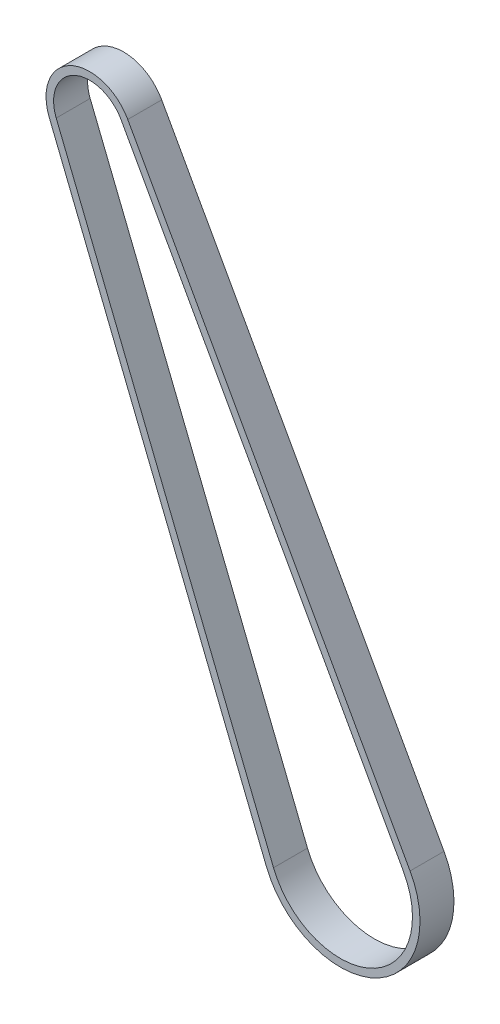
ISO-10303-21;
HEADER;
FILE_DESCRIPTION(('STEP AP214'),'2;1');
FILE_NAME('part.step','',(''),(''),'','','');
FILE_SCHEMA(('AUTOMOTIVE_DESIGN { 1 0 10303 214 1 1 1 1 }'));
ENDSEC;
DATA;
#1=APPLICATION_CONTEXT('core data for automotive mechanical design processes');
#2=APPLICATION_PROTOCOL_DEFINITION('international standard','automotive_design',2000,#1);
#3=PRODUCT_CONTEXT('',#1,'mechanical');
#4=PRODUCT('Part','Part','',(#3));
#5=PRODUCT_RELATED_PRODUCT_CATEGORY('part','',(#4));
#6=PRODUCT_DEFINITION_FORMATION('','',#4);
#7=PRODUCT_DEFINITION_CONTEXT('part definition',#1,'design');
#8=PRODUCT_DEFINITION('design','',#6,#7);
#9=PRODUCT_DEFINITION_SHAPE('','',#8);
#10=(LENGTH_UNIT() NAMED_UNIT(*) SI_UNIT(.MILLI.,.METRE.));
#11=(NAMED_UNIT(*) PLANE_ANGLE_UNIT() SI_UNIT($,.RADIAN.));
#12=(NAMED_UNIT(*) SI_UNIT($,.STERADIAN.) SOLID_ANGLE_UNIT());
#13=UNCERTAINTY_MEASURE_WITH_UNIT(LENGTH_MEASURE(1.E-05),#10,'distance_accuracy_value','');
#14=(GEOMETRIC_REPRESENTATION_CONTEXT(3) GLOBAL_UNCERTAINTY_ASSIGNED_CONTEXT((#13)) GLOBAL_UNIT_ASSIGNED_CONTEXT((#10,
#11,#12)) REPRESENTATION_CONTEXT('',''));
#15=CARTESIAN_POINT('',(0.,0.,0.));
#16=DIRECTION('',(0.,0.,1.));
#17=DIRECTION('',(1.,0.,0.));
#18=AXIS2_PLACEMENT_3D('',#15,#16,#17);
#19=CARTESIAN_POINT('',(0.,0.,4.5));
#20=DIRECTION('',(0.,0.,-1.));
#21=DIRECTION('',(-1.,0.,0.));
#22=AXIS2_PLACEMENT_3D('',#19,#20,#21);
#23=PLANE('',#22);
#24=CARTESIAN_POINT('',(0.,0.,4.5));
#25=DIRECTION('',(0.,0.,-1.));
#26=DIRECTION('',(-1.,0.,0.));
#27=AXIS2_PLACEMENT_3D('',#24,#25,#26);
#28=CIRCLE('',#27,11.5504);
#29=CARTESIAN_POINT('',(10.1042592331925,5.59604195020407,4.5));
#30=VERTEX_POINT('',#29);
#31=CARTESIAN_POINT('',(-10.7168657589158,-4.30819317874412,4.5));
#32=VERTEX_POINT('',#31);
#33=EDGE_CURVE('E167',#30,#32,#28,.F.);
#34=ORIENTED_EDGE('',*,*,#33,.T.);
#35=DIRECTION('',(0.372990820988376,-0.92783503245912,0.));
#36=VECTOR('',#35,1.);
#37=CARTESIAN_POINT('',(-10.7168657589158,-4.30819317874414,4.5));
#38=LINE('',#37,#36);
#39=CARTESIAN_POINT('',(46.8747189822682,-147.57040471551,4.5));
#40=VERTEX_POINT('',#39);
#41=EDGE_CURVE('E170',#32,#40,#38,.T.);
#42=ORIENTED_EDGE('',*,*,#41,.T.);
#43=CARTESIAN_POINT('',(66.4527804351816,-139.699999999998,4.5));
#44=DIRECTION('',(0.,0.,-1.));
#45=DIRECTION('',(-1.,0.,0.));
#46=AXIS2_PLACEMENT_3D('',#43,#44,#45);
#47=CIRCLE('',#46,21.1008);
#48=CARTESIAN_POINT('',(84.9117042151155,-129.476894135018,4.5));
#49=VERTEX_POINT('',#48);
#50=EDGE_CURVE('E174',#40,#49,#47,.F.);
#51=ORIENTED_EDGE('',*,*,#50,.T.);
#52=DIRECTION('',(-0.484489017714025,0.874797343225561,0.));
#53=VECTOR('',#52,1.);
#54=CARTESIAN_POINT('',(10.1042592331925,5.59604195020407,4.5));
#55=LINE('',#54,#53);
#56=EDGE_CURVE('E176',#49,#30,#55,.T.);
#57=ORIENTED_EDGE('',*,*,#56,.T.);
#58=EDGE_LOOP('',(#34,#42,#51,#57));
#59=FACE_BOUND('',#58,.T.);
#60=CARTESIAN_POINT('',(0.,0.,4.5));
#61=DIRECTION('',(0.,0.,1.));
#62=DIRECTION('',(-1.,0.,0.));
#63=AXIS2_PLACEMENT_3D('',#60,#61,#62);
#64=CIRCLE('',#63,9.5504);
#65=CARTESIAN_POINT('',(8.3546645467414,4.62706391477602,4.5));
#66=VERTEX_POINT('',#65);
#67=CARTESIAN_POINT('',(-8.86119569399758,-3.56221153676739,4.5));
#68=VERTEX_POINT('',#67);
#69=EDGE_CURVE('E126',#66,#68,#64,.T.);
#70=ORIENTED_EDGE('',*,*,#69,.F.);
#71=DIRECTION('',(-0.484489017714025,0.874797343225561,0.));
#72=VECTOR('',#71,1.);
#73=CARTESIAN_POINT('',(8.3546645467414,4.62706391477602,4.5));
#74=LINE('',#73,#72);
#75=CARTESIAN_POINT('',(83.1621095286644,-130.445872170446,4.5));
#76=VERTEX_POINT('',#75);
#77=EDGE_CURVE('E152',#76,#66,#74,.T.);
#78=ORIENTED_EDGE('',*,*,#77,.F.);
#79=CARTESIAN_POINT('',(66.4527804351816,-139.699999999998,4.5));
#80=DIRECTION('',(0.,0.,1.));
#81=DIRECTION('',(-1.,0.,0.));
#82=AXIS2_PLACEMENT_3D('',#79,#80,#81);
#83=CIRCLE('',#82,19.1008);
#84=CARTESIAN_POINT('',(48.7303890471865,-146.824423073533,4.5));
#85=VERTEX_POINT('',#84);
#86=EDGE_CURVE('E146',#85,#76,#83,.T.);
#87=ORIENTED_EDGE('',*,*,#86,.F.);
#88=DIRECTION('',(0.372990820988376,-0.92783503245912,0.));
#89=VECTOR('',#88,1.);
#90=CARTESIAN_POINT('',(48.7303890471865,-146.824423073533,4.5));
#91=LINE('',#90,#89);
#92=EDGE_CURVE('E134',#68,#85,#91,.T.);
#93=ORIENTED_EDGE('',*,*,#92,.F.);
#94=EDGE_LOOP('',(#70,#78,#87,#93));
#95=FACE_BOUND('',#94,.T.);
#96=ADVANCED_FACE('F61',(#59,#95),#23,.F.);
#97=CARTESIAN_POINT('',(0.,0.,-4.5));
#98=DIRECTION('',(0.,0.,-1.));
#99=DIRECTION('',(-1.,0.,0.));
#100=AXIS2_PLACEMENT_3D('',#97,#98,#99);
#101=PLANE('',#100);
#102=CARTESIAN_POINT('',(0.,0.,-4.5));
#103=DIRECTION('',(0.,0.,-1.));
#104=DIRECTION('',(-1.,0.,0.));
#105=AXIS2_PLACEMENT_3D('',#102,#103,#104);
#106=CIRCLE('',#105,11.5504);
#107=CARTESIAN_POINT('',(10.1042592331925,5.59604195020407,-4.5));
#108=VERTEX_POINT('',#107);
#109=CARTESIAN_POINT('',(-10.7168657589158,-4.30819317874412,-4.5));
#110=VERTEX_POINT('',#109);
#111=EDGE_CURVE('E142',#108,#110,#106,.F.);
#112=ORIENTED_EDGE('',*,*,#111,.F.);
#113=DIRECTION('',(-0.484489017714025,0.874797343225561,0.));
#114=VECTOR('',#113,1.);
#115=CARTESIAN_POINT('',(10.1042592331925,5.59604195020407,-4.5));
#116=LINE('',#115,#114);
#117=CARTESIAN_POINT('',(84.9117042151155,-129.476894135018,-4.5));
#118=VERTEX_POINT('',#117);
#119=EDGE_CURVE('E171',#118,#108,#116,.T.);
#120=ORIENTED_EDGE('',*,*,#119,.F.);
#121=CARTESIAN_POINT('',(66.4527804351816,-139.699999999998,-4.5));
#122=DIRECTION('',(0.,0.,-1.));
#123=DIRECTION('',(-1.,0.,0.));
#124=AXIS2_PLACEMENT_3D('',#121,#122,#123);
#125=CIRCLE('',#124,21.1008);
#126=CARTESIAN_POINT('',(46.8747189822682,-147.57040471551,-4.5));
#127=VERTEX_POINT('',#126);
#128=EDGE_CURVE('E183',#127,#118,#125,.F.);
#129=ORIENTED_EDGE('',*,*,#128,.F.);
#130=DIRECTION('',(0.372990820988376,-0.92783503245912,0.));
#131=VECTOR('',#130,1.);
#132=CARTESIAN_POINT('',(-10.7168657589158,-4.30819317874414,-4.5));
#133=LINE('',#132,#131);
#134=EDGE_CURVE('E181',#110,#127,#133,.T.);
#135=ORIENTED_EDGE('',*,*,#134,.F.);
#136=EDGE_LOOP('',(#112,#120,#129,#135));
#137=FACE_BOUND('',#136,.T.);
#138=DIRECTION('',(-0.484489017714025,0.874797343225561,0.));
#139=VECTOR('',#138,1.);
#140=CARTESIAN_POINT('',(8.3546645467414,4.62706391477602,-4.5));
#141=LINE('',#140,#139);
#142=CARTESIAN_POINT('',(83.1621095286644,-130.445872170446,-4.5));
#143=VERTEX_POINT('',#142);
#144=CARTESIAN_POINT('',(8.3546645467414,4.62706391477602,-4.5));
#145=VERTEX_POINT('',#144);
#146=EDGE_CURVE('E135',#143,#145,#141,.T.);
#147=ORIENTED_EDGE('',*,*,#146,.T.);
#148=CARTESIAN_POINT('',(0.,0.,-4.5));
#149=DIRECTION('',(0.,0.,1.));
#150=DIRECTION('',(-1.,0.,0.));
#151=AXIS2_PLACEMENT_3D('',#148,#149,#150);
#152=CIRCLE('',#151,9.5504);
#153=CARTESIAN_POINT('',(-8.86119569399758,-3.56221153676739,-4.5));
#154=VERTEX_POINT('',#153);
#155=EDGE_CURVE('E84',#145,#154,#152,.T.);
#156=ORIENTED_EDGE('',*,*,#155,.T.);
#157=DIRECTION('',(0.372990820988376,-0.92783503245912,0.));
#158=VECTOR('',#157,1.);
#159=CARTESIAN_POINT('',(48.7303890471865,-146.824423073533,-4.5));
#160=LINE('',#159,#158);
#161=CARTESIAN_POINT('',(48.7303890471865,-146.824423073533,-4.5));
#162=VERTEX_POINT('',#161);
#163=EDGE_CURVE('E141',#154,#162,#160,.T.);
#164=ORIENTED_EDGE('',*,*,#163,.T.);
#165=CARTESIAN_POINT('',(66.4527804351816,-139.699999999998,-4.5));
#166=DIRECTION('',(0.,0.,1.));
#167=DIRECTION('',(-1.,0.,0.));
#168=AXIS2_PLACEMENT_3D('',#165,#166,#167);
#169=CIRCLE('',#168,19.1008);
#170=EDGE_CURVE('E158',#162,#143,#169,.T.);
#171=ORIENTED_EDGE('',*,*,#170,.T.);
#172=EDGE_LOOP('',(#147,#156,#164,#171));
#173=FACE_BOUND('',#172,.T.);
#174=ADVANCED_FACE('F202',(#137,#173),#101,.T.);
#175=CARTESIAN_POINT('',(0.,0.,4.5));
#176=DIRECTION('',(0.,0.,-1.));
#177=DIRECTION('',(-1.,0.,0.));
#178=AXIS2_PLACEMENT_3D('',#175,#176,#177);
#179=CYLINDRICAL_SURFACE('',#178,11.5504);
#180=ORIENTED_EDGE('',*,*,#111,.T.);
#181=DIRECTION('',(0.,0.,-1.));
#182=VECTOR('',#181,1.);
#183=CARTESIAN_POINT('',(-10.7168657589158,-4.30819317874412,4.5));
#184=LINE('',#183,#182);
#185=EDGE_CURVE('E12',#32,#110,#184,.T.);
#186=ORIENTED_EDGE('',*,*,#185,.F.);
#187=ORIENTED_EDGE('',*,*,#33,.F.);
#188=DIRECTION('',(0.,0.,-1.));
#189=VECTOR('',#188,1.);
#190=CARTESIAN_POINT('',(10.1042592331925,5.59604195020407,4.5));
#191=LINE('',#190,#189);
#192=EDGE_CURVE('E178',#30,#108,#191,.T.);
#193=ORIENTED_EDGE('',*,*,#192,.T.);
#194=EDGE_LOOP('',(#180,#186,#187,#193));
#195=FACE_BOUND('',#194,.T.);
#196=ADVANCED_FACE('F63',(#195),#179,.T.);
#197=CARTESIAN_POINT('',(-10.7168657589158,-4.30819317874414,4.5));
#198=DIRECTION('',(0.92783503245912,0.372990820988376,0.));
#199=DIRECTION('',(-0.372990820988376,0.92783503245912,0.));
#200=AXIS2_PLACEMENT_3D('',#197,#198,#199);
#201=PLANE('',#200);
#202=ORIENTED_EDGE('',*,*,#134,.T.);
#203=DIRECTION('',(0.,0.,-1.));
#204=VECTOR('',#203,1.);
#205=CARTESIAN_POINT('',(46.8747189822682,-147.57040471551,4.5));
#206=LINE('',#205,#204);
#207=EDGE_CURVE('E69',#40,#127,#206,.T.);
#208=ORIENTED_EDGE('',*,*,#207,.F.);
#209=ORIENTED_EDGE('',*,*,#41,.F.);
#210=ORIENTED_EDGE('',*,*,#185,.T.);
#211=EDGE_LOOP('',(#202,#208,#209,#210));
#212=FACE_BOUND('',#211,.T.);
#213=ADVANCED_FACE('F212',(#212),#201,.F.);
#214=CARTESIAN_POINT('',(66.4527804351816,-139.699999999998,4.5));
#215=DIRECTION('',(0.,0.,-1.));
#216=DIRECTION('',(-1.,0.,0.));
#217=AXIS2_PLACEMENT_3D('',#214,#215,#216);
#218=CYLINDRICAL_SURFACE('',#217,21.1008);
#219=ORIENTED_EDGE('',*,*,#128,.T.);
#220=DIRECTION('',(0.,0.,-1.));
#221=VECTOR('',#220,1.);
#222=CARTESIAN_POINT('',(84.9117042151155,-129.476894135018,4.5));
#223=LINE('',#222,#221);
#224=EDGE_CURVE('E189',#49,#118,#223,.T.);
#225=ORIENTED_EDGE('',*,*,#224,.F.);
#226=ORIENTED_EDGE('',*,*,#50,.F.);
#227=ORIENTED_EDGE('',*,*,#207,.T.);
#228=EDGE_LOOP('',(#219,#225,#226,#227));
#229=FACE_BOUND('',#228,.T.);
#230=ADVANCED_FACE('F196',(#229),#218,.T.);
#231=CARTESIAN_POINT('',(10.1042592331925,5.59604195020407,4.5));
#232=DIRECTION('',(-0.874797343225561,-0.484489017714025,0.));
#233=DIRECTION('',(0.484489017714025,-0.874797343225561,0.));
#234=AXIS2_PLACEMENT_3D('',#231,#232,#233);
#235=PLANE('',#234);
#236=ORIENTED_EDGE('',*,*,#119,.T.);
#237=ORIENTED_EDGE('',*,*,#192,.F.);
#238=ORIENTED_EDGE('',*,*,#56,.F.);
#239=ORIENTED_EDGE('',*,*,#224,.T.);
#240=EDGE_LOOP('',(#236,#237,#238,#239));
#241=FACE_BOUND('',#240,.T.);
#242=ADVANCED_FACE('F206',(#241),#235,.F.);
#243=CARTESIAN_POINT('',(0.,0.,4.5));
#244=DIRECTION('',(0.,0.,-1.));
#245=DIRECTION('',(-1.,0.,0.));
#246=AXIS2_PLACEMENT_3D('',#243,#244,#245);
#247=CYLINDRICAL_SURFACE('',#246,9.5504);
#248=ORIENTED_EDGE('',*,*,#155,.F.);
#249=DIRECTION('',(0.,0.,-1.));
#250=VECTOR('',#249,1.);
#251=CARTESIAN_POINT('',(8.3546645467414,4.62706391477602,4.5));
#252=LINE('',#251,#250);
#253=EDGE_CURVE('E130',#66,#145,#252,.T.);
#254=ORIENTED_EDGE('',*,*,#253,.F.);
#255=ORIENTED_EDGE('',*,*,#69,.T.);
#256=DIRECTION('',(0.,0.,-1.));
#257=VECTOR('',#256,1.);
#258=CARTESIAN_POINT('',(-8.86119569399758,-3.56221153676739,4.5));
#259=LINE('',#258,#257);
#260=EDGE_CURVE('E129',#68,#154,#259,.T.);
#261=ORIENTED_EDGE('',*,*,#260,.T.);
#262=EDGE_LOOP('',(#248,#254,#255,#261));
#263=FACE_BOUND('',#262,.T.);
#264=ADVANCED_FACE('F128',(#263),#247,.F.);
#265=CARTESIAN_POINT('',(48.7303890471865,-146.824423073533,4.5));
#266=DIRECTION('',(0.92783503245912,0.372990820988376,0.));
#267=DIRECTION('',(-0.372990820988376,0.92783503245912,0.));
#268=AXIS2_PLACEMENT_3D('',#265,#266,#267);
#269=PLANE('',#268);
#270=ORIENTED_EDGE('',*,*,#163,.F.);
#271=ORIENTED_EDGE('',*,*,#260,.F.);
#272=ORIENTED_EDGE('',*,*,#92,.T.);
#273=DIRECTION('',(0.,0.,-1.));
#274=VECTOR('',#273,1.);
#275=CARTESIAN_POINT('',(48.7303890471865,-146.824423073533,4.5));
#276=LINE('',#275,#274);
#277=EDGE_CURVE('E143',#85,#162,#276,.T.);
#278=ORIENTED_EDGE('',*,*,#277,.T.);
#279=EDGE_LOOP('',(#270,#271,#272,#278));
#280=FACE_BOUND('',#279,.T.);
#281=ADVANCED_FACE('F138',(#280),#269,.T.);
#282=CARTESIAN_POINT('',(66.4527804351816,-139.699999999998,4.5));
#283=DIRECTION('',(0.,0.,-1.));
#284=DIRECTION('',(-1.,0.,0.));
#285=AXIS2_PLACEMENT_3D('',#282,#283,#284);
#286=CYLINDRICAL_SURFACE('',#285,19.1008);
#287=ORIENTED_EDGE('',*,*,#170,.F.);
#288=ORIENTED_EDGE('',*,*,#277,.F.);
#289=ORIENTED_EDGE('',*,*,#86,.T.);
#290=DIRECTION('',(0.,0.,-1.));
#291=VECTOR('',#290,1.);
#292=CARTESIAN_POINT('',(83.1621095286644,-130.445872170446,4.5));
#293=LINE('',#292,#291);
#294=EDGE_CURVE('E76',#76,#143,#293,.T.);
#295=ORIENTED_EDGE('',*,*,#294,.T.);
#296=EDGE_LOOP('',(#287,#288,#289,#295));
#297=FACE_BOUND('',#296,.T.);
#298=ADVANCED_FACE('F234',(#297),#286,.F.);
#299=CARTESIAN_POINT('',(8.3546645467414,4.62706391477602,4.5));
#300=DIRECTION('',(-0.874797343225561,-0.484489017714025,0.));
#301=DIRECTION('',(0.484489017714025,-0.874797343225561,0.));
#302=AXIS2_PLACEMENT_3D('',#299,#300,#301);
#303=PLANE('',#302);
#304=ORIENTED_EDGE('',*,*,#146,.F.);
#305=ORIENTED_EDGE('',*,*,#294,.F.);
#306=ORIENTED_EDGE('',*,*,#77,.T.);
#307=ORIENTED_EDGE('',*,*,#253,.T.);
#308=EDGE_LOOP('',(#304,#305,#306,#307));
#309=FACE_BOUND('',#308,.T.);
#310=ADVANCED_FACE('F238',(#309),#303,.T.);
#311=CLOSED_SHELL('',(#96,#174,#196,#213,#230,#242,#264,#281,#298,#310));
#312=MANIFOLD_SOLID_BREP('B2',#311);
#313=ADVANCED_BREP_SHAPE_REPRESENTATION('',(#18,#312),#14);
#314=SHAPE_DEFINITION_REPRESENTATION(#9,#313);
ENDSEC;
END-ISO-10303-21;
